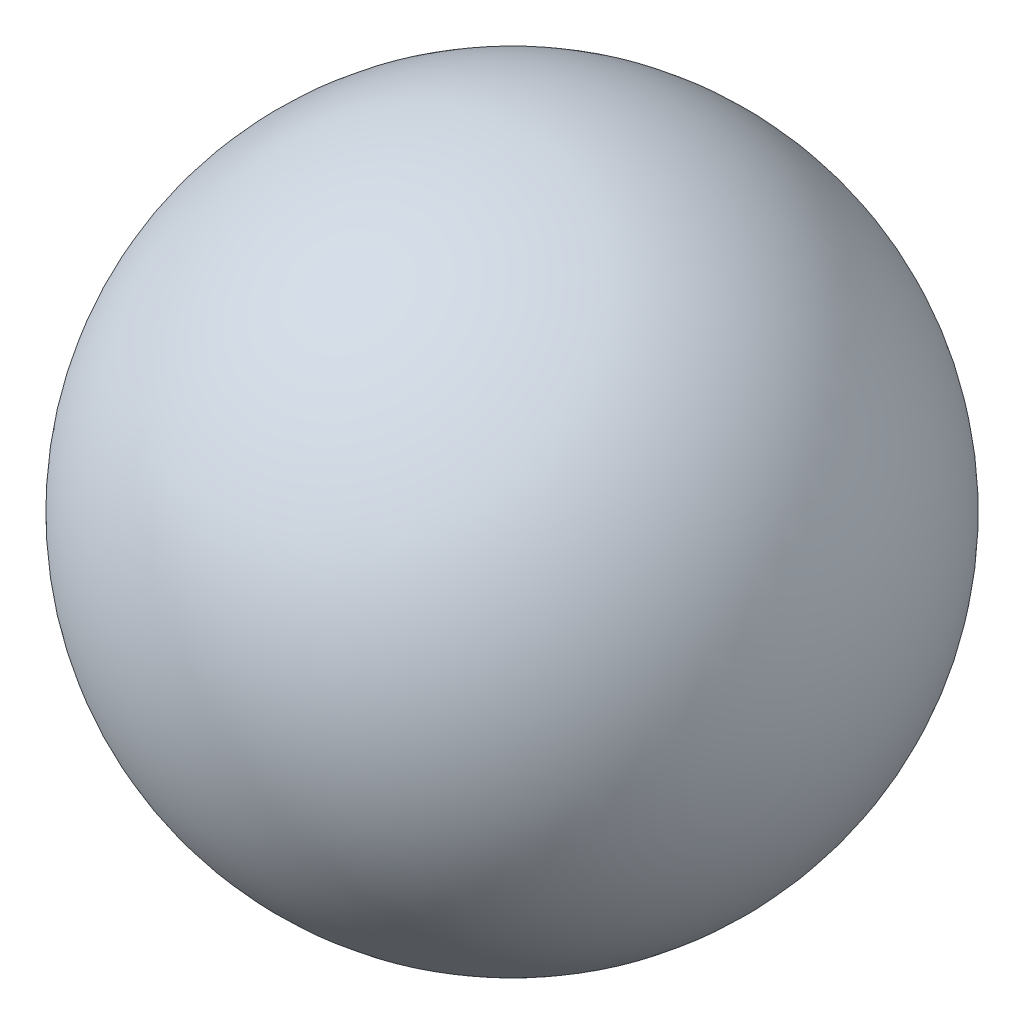
ISO-10303-21;
HEADER;
FILE_DESCRIPTION(('STEP AP214'),'2;1');
FILE_NAME('part.step','',(''),(''),'','','');
FILE_SCHEMA(('AUTOMOTIVE_DESIGN { 1 0 10303 214 1 1 1 1 }'));
ENDSEC;
DATA;
#1=APPLICATION_CONTEXT('core data for automotive mechanical design processes');
#2=APPLICATION_PROTOCOL_DEFINITION('international standard','automotive_design',2000,#1);
#3=PRODUCT_CONTEXT('',#1,'mechanical');
#4=PRODUCT('Part','Part','',(#3));
#5=PRODUCT_RELATED_PRODUCT_CATEGORY('part','',(#4));
#6=PRODUCT_DEFINITION_FORMATION('','',#4);
#7=PRODUCT_DEFINITION_CONTEXT('part definition',#1,'design');
#8=PRODUCT_DEFINITION('design','',#6,#7);
#9=PRODUCT_DEFINITION_SHAPE('','',#8);
#10=(LENGTH_UNIT() NAMED_UNIT(*) SI_UNIT(.MILLI.,.METRE.));
#11=(NAMED_UNIT(*) PLANE_ANGLE_UNIT() SI_UNIT($,.RADIAN.));
#12=(NAMED_UNIT(*) SI_UNIT($,.STERADIAN.) SOLID_ANGLE_UNIT());
#13=UNCERTAINTY_MEASURE_WITH_UNIT(LENGTH_MEASURE(1.E-05),#10,'distance_accuracy_value','');
#14=(GEOMETRIC_REPRESENTATION_CONTEXT(3) GLOBAL_UNCERTAINTY_ASSIGNED_CONTEXT((#13)) GLOBAL_UNIT_ASSIGNED_CONTEXT((#10,
#11,#12)) REPRESENTATION_CONTEXT('',''));
#15=CARTESIAN_POINT('',(0.,0.,0.));
#16=DIRECTION('',(0.,0.,1.));
#17=DIRECTION('',(1.,0.,0.));
#18=AXIS2_PLACEMENT_3D('',#15,#16,#17);
#19=CARTESIAN_POINT('',(0.,0.,0.));
#20=DIRECTION('',(0.,1.,0.));
#21=DIRECTION('',(1.,0.,0.));
#22=AXIS2_PLACEMENT_3D('',#19,#20,#21);
#23=SPHERICAL_SURFACE('',#22,105.);
#24=CARTESIAN_POINT('',(0.,105.,0.));
#25=VERTEX_POINT('',#24);
#26=VERTEX_LOOP('',#25);
#27=FACE_BOUND('',#26,.T.);
#28=ADVANCED_FACE('F31',(#27),#23,.T.);
#29=CLOSED_SHELL('',(#28));
#30=MANIFOLD_SOLID_BREP('B2',#29);
#31=ADVANCED_BREP_SHAPE_REPRESENTATION('',(#18,#30),#14);
#32=SHAPE_DEFINITION_REPRESENTATION(#9,#31);
ENDSEC;
END-ISO-10303-21;
